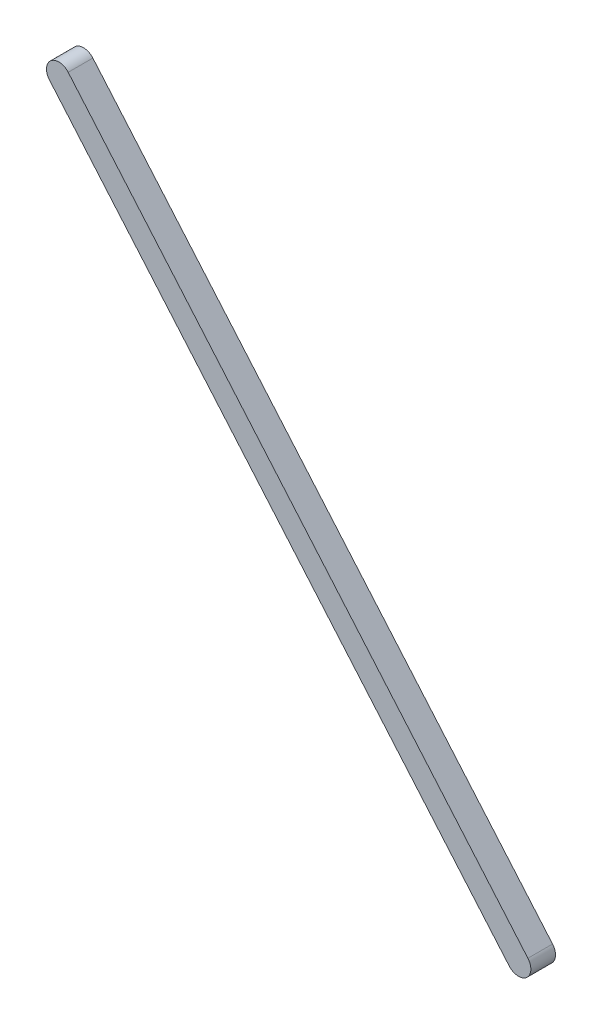
ISO-10303-21;
HEADER;
FILE_DESCRIPTION(('STEP AP214'),'2;1');
FILE_NAME('part.step','',(''),(''),'','','');
FILE_SCHEMA(('AUTOMOTIVE_DESIGN { 1 0 10303 214 1 1 1 1 }'));
ENDSEC;
DATA;
#1=APPLICATION_CONTEXT('core data for automotive mechanical design processes');
#2=APPLICATION_PROTOCOL_DEFINITION('international standard','automotive_design',2000,#1);
#3=PRODUCT_CONTEXT('',#1,'mechanical');
#4=PRODUCT('Part','Part','',(#3));
#5=PRODUCT_RELATED_PRODUCT_CATEGORY('part','',(#4));
#6=PRODUCT_DEFINITION_FORMATION('','',#4);
#7=PRODUCT_DEFINITION_CONTEXT('part definition',#1,'design');
#8=PRODUCT_DEFINITION('design','',#6,#7);
#9=PRODUCT_DEFINITION_SHAPE('','',#8);
#10=(LENGTH_UNIT() NAMED_UNIT(*) SI_UNIT(.MILLI.,.METRE.));
#11=(NAMED_UNIT(*) PLANE_ANGLE_UNIT() SI_UNIT($,.RADIAN.));
#12=(NAMED_UNIT(*) SI_UNIT($,.STERADIAN.) SOLID_ANGLE_UNIT());
#13=UNCERTAINTY_MEASURE_WITH_UNIT(LENGTH_MEASURE(1.E-05),#10,'distance_accuracy_value','');
#14=(GEOMETRIC_REPRESENTATION_CONTEXT(3) GLOBAL_UNCERTAINTY_ASSIGNED_CONTEXT((#13)) GLOBAL_UNIT_ASSIGNED_CONTEXT((#10,
#11,#12)) REPRESENTATION_CONTEXT('',''));
#15=CARTESIAN_POINT('',(0.,0.,0.));
#16=DIRECTION('',(0.,0.,1.));
#17=DIRECTION('',(1.,0.,0.));
#18=AXIS2_PLACEMENT_3D('',#15,#16,#17);
#19=CARTESIAN_POINT('',(949.617254588,136.500462658,-20.));
#20=DIRECTION('',(0.759894632415571,0.650046265758064,0.));
#21=DIRECTION('',(-0.650046265758064,0.759894632415571,0.));
#22=AXIS2_PLACEMENT_3D('',#19,#20,#21);
#23=PLANE('',#22);
#24=DIRECTION('',(-0.650046265758064,0.759894632415571,0.));
#25=VECTOR('',#24,1.);
#26=CARTESIAN_POINT('',(949.617254588,136.500462658,-20.));
#27=LINE('',#26,#25);
#28=CARTESIAN_POINT('',(949.617254586844,136.500462659232,-20.));
#29=VERTEX_POINT('',#28);
#30=CARTESIAN_POINT('',(576.618600054597,572.530466073021,-20.));
#31=VERTEX_POINT('',#30);
#32=EDGE_CURVE('E60',#29,#31,#27,.T.);
#33=ORIENTED_EDGE('',*,*,#32,.T.);
#34=DIRECTION('',(0.,0.,-1.));
#35=VECTOR('',#34,1.);
#36=CARTESIAN_POINT('',(576.618600053416,572.530466074783,-10.));
#37=LINE('',#36,#35);
#38=CARTESIAN_POINT('',(576.618600052481,572.530466074385,0.));
#39=VERTEX_POINT('',#38);
#40=EDGE_CURVE('E71',#31,#39,#37,.F.);
#41=ORIENTED_EDGE('',*,*,#40,.T.);
#42=DIRECTION('',(-0.650046266124761,0.759894632101883,0.));
#43=VECTOR('',#42,1.);
#44=CARTESIAN_POINT('',(949.617254782366,136.500462854533,0.));
#45=LINE('',#44,#43);
#46=CARTESIAN_POINT('',(949.617254689934,136.500462750594,0.));
#47=VERTEX_POINT('',#46);
#48=EDGE_CURVE('E20',#47,#39,#45,.T.);
#49=ORIENTED_EDGE('',*,*,#48,.F.);
#50=DIRECTION('',(0.,0.,1.));
#51=VECTOR('',#50,1.);
#52=CARTESIAN_POINT('',(949.617254585416,136.500462660784,-10.));
#53=LINE('',#52,#51);
#54=EDGE_CURVE('E85',#47,#29,#53,.F.);
#55=ORIENTED_EDGE('',*,*,#54,.T.);
#56=EDGE_LOOP('',(#33,#41,#49,#55));
#57=FACE_BOUND('',#56,.T.);
#58=ADVANCED_FACE('F16',(#57),#23,.T.);
#59=CARTESIAN_POINT('',(569.019653732,566.030003414,-20.));
#60=DIRECTION('',(0.,0.,1.));
#61=DIRECTION('',(0.,-1.,0.));
#62=AXIS2_PLACEMENT_3D('',#59,#60,#61);
#63=CYLINDRICAL_SURFACE('',#62,10.);
#64=ORIENTED_EDGE('',*,*,#40,.F.);
#65=CARTESIAN_POINT('',(569.019653732,566.030003414,-20.));
#66=DIRECTION('',(0.,0.,1.));
#67=DIRECTION('',(0.,-1.,0.));
#68=AXIS2_PLACEMENT_3D('',#65,#66,#67);
#69=CIRCLE('',#68,10.);
#70=CARTESIAN_POINT('',(561.42070740786,559.529540756164,-20.));
#71=VERTEX_POINT('',#70);
#72=EDGE_CURVE('E66',#31,#71,#69,.T.);
#73=ORIENTED_EDGE('',*,*,#72,.T.);
#74=DIRECTION('',(0.,0.,-1.));
#75=VECTOR('',#74,1.);
#76=CARTESIAN_POINT('',(561.420707408,559.529540756,-10.));
#77=LINE('',#76,#75);
#78=CARTESIAN_POINT('',(561.420707304774,559.529540664797,0.));
#79=VERTEX_POINT('',#78);
#80=EDGE_CURVE('E70',#79,#71,#77,.T.);
#81=ORIENTED_EDGE('',*,*,#80,.F.);
#82=CARTESIAN_POINT('',(569.019653732,566.030003414,0.));
#83=DIRECTION('',(0.,0.,1.));
#84=DIRECTION('',(0.,-1.,0.));
#85=AXIS2_PLACEMENT_3D('',#82,#83,#84);
#86=CIRCLE('',#85,10.);
#87=EDGE_CURVE('E86',#39,#79,#86,.T.);
#88=ORIENTED_EDGE('',*,*,#87,.F.);
#89=EDGE_LOOP('',(#64,#73,#81,#88));
#90=FACE_BOUND('',#89,.T.);
#91=ADVANCED_FACE('F68',(#90),#63,.T.);
#92=CARTESIAN_POINT('',(561.420707408,559.529540756,-20.));
#93=DIRECTION('',(-0.759894632416307,-0.650046265757204,0.));
#94=DIRECTION('',(0.650046265757204,-0.759894632416307,0.));
#95=AXIS2_PLACEMENT_3D('',#92,#93,#94);
#96=PLANE('',#95);
#97=DIRECTION('',(0.650046265757204,-0.759894632416307,0.));
#98=VECTOR('',#97,1.);
#99=CARTESIAN_POINT('',(561.420707408,559.529540756,-20.));
#100=LINE('',#99,#98);
#101=CARTESIAN_POINT('',(934.419361939235,123.499537343013,-20.));
#102=VERTEX_POINT('',#101);
#103=EDGE_CURVE('E74',#71,#102,#100,.T.);
#104=ORIENTED_EDGE('',*,*,#103,.T.);
#105=DIRECTION('',(0.,0.,-1.));
#106=VECTOR('',#105,1.);
#107=CARTESIAN_POINT('',(934.41936193875,123.499537343698,-10.));
#108=LINE('',#107,#106);
#109=CARTESIAN_POINT('',(934.419361941602,123.499537341855,0.));
#110=VERTEX_POINT('',#109);
#111=EDGE_CURVE('E35',#102,#110,#108,.F.);
#112=ORIENTED_EDGE('',*,*,#111,.T.);
#113=DIRECTION('',(0.650046266124761,-0.759894632101883,0.));
#114=VECTOR('',#113,1.);
#115=CARTESIAN_POINT('',(561.420707213634,559.529540559467,0.));
#116=LINE('',#115,#114);
#117=EDGE_CURVE('E77',#79,#110,#116,.T.);
#118=ORIENTED_EDGE('',*,*,#117,.F.);
#119=ORIENTED_EDGE('',*,*,#80,.T.);
#120=EDGE_LOOP('',(#104,#112,#118,#119));
#121=FACE_BOUND('',#120,.T.);
#122=ADVANCED_FACE('F76',(#121),#96,.T.);
#123=CARTESIAN_POINT('',(556.661661805,117.26381998,0.));
#124=DIRECTION('',(0.,0.,1.));
#125=DIRECTION('',(1.,0.,0.));
#126=AXIS2_PLACEMENT_3D('',#123,#124,#125);
#127=PLANE('',#126);
#128=ORIENTED_EDGE('',*,*,#87,.T.);
#129=ORIENTED_EDGE('',*,*,#117,.T.);
#130=CARTESIAN_POINT('',(942.018308264,130.,0.));
#131=DIRECTION('',(0.,0.,1.));
#132=DIRECTION('',(0.,-1.,0.));
#133=AXIS2_PLACEMENT_3D('',#130,#131,#132);
#134=CIRCLE('',#133,10.);
#135=EDGE_CURVE('E26',#110,#47,#134,.T.);
#136=ORIENTED_EDGE('',*,*,#135,.T.);
#137=ORIENTED_EDGE('',*,*,#48,.T.);
#138=EDGE_LOOP('',(#128,#129,#136,#137));
#139=FACE_BOUND('',#138,.T.);
#140=ADVANCED_FACE('F87',(#139),#127,.T.);
#141=CARTESIAN_POINT('',(556.661661805,117.26381998,-20.));
#142=DIRECTION('',(0.,0.,1.));
#143=DIRECTION('',(1.,0.,0.));
#144=AXIS2_PLACEMENT_3D('',#141,#142,#143);
#145=PLANE('',#144);
#146=ORIENTED_EDGE('',*,*,#103,.F.);
#147=ORIENTED_EDGE('',*,*,#72,.F.);
#148=ORIENTED_EDGE('',*,*,#32,.F.);
#149=CARTESIAN_POINT('',(942.018308264,130.,-20.));
#150=DIRECTION('',(0.,0.,1.));
#151=DIRECTION('',(0.,-1.,0.));
#152=AXIS2_PLACEMENT_3D('',#149,#150,#151);
#153=CIRCLE('',#152,10.);
#154=EDGE_CURVE('E10',#29,#102,#153,.F.);
#155=ORIENTED_EDGE('',*,*,#154,.T.);
#156=EDGE_LOOP('',(#146,#147,#148,#155));
#157=FACE_BOUND('',#156,.T.);
#158=ADVANCED_FACE('F18',(#157),#145,.F.);
#159=CARTESIAN_POINT('',(942.018308264,130.,-20.));
#160=DIRECTION('',(0.,0.,1.));
#161=DIRECTION('',(0.,-1.,0.));
#162=AXIS2_PLACEMENT_3D('',#159,#160,#161);
#163=CYLINDRICAL_SURFACE('',#162,10.);
#164=ORIENTED_EDGE('',*,*,#154,.F.);
#165=ORIENTED_EDGE('',*,*,#54,.F.);
#166=ORIENTED_EDGE('',*,*,#135,.F.);
#167=ORIENTED_EDGE('',*,*,#111,.F.);
#168=EDGE_LOOP('',(#164,#165,#166,#167));
#169=FACE_BOUND('',#168,.T.);
#170=ADVANCED_FACE('F88',(#169),#163,.T.);
#171=CLOSED_SHELL('',(#58,#91,#122,#140,#158,#170));
#172=MANIFOLD_SOLID_BREP('B1',#171);
#173=ADVANCED_BREP_SHAPE_REPRESENTATION('',(#18,#172),#14);
#174=SHAPE_DEFINITION_REPRESENTATION(#9,#173);
ENDSEC;
END-ISO-10303-21;
